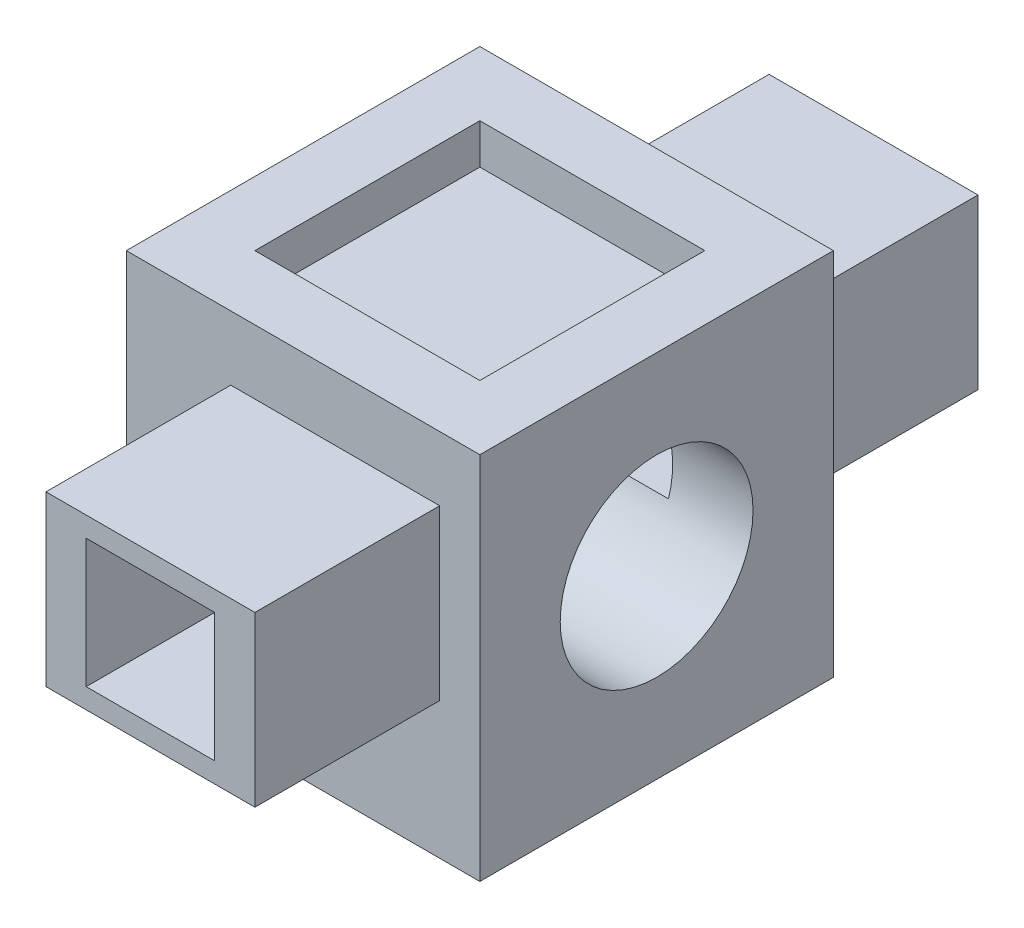
ISO-10303-21;
HEADER;
FILE_DESCRIPTION(('STEP AP214'),'2;1');
FILE_NAME('part.step','',(''),(''),'','','');
FILE_SCHEMA(('AUTOMOTIVE_DESIGN { 1 0 10303 214 1 1 1 1 }'));
ENDSEC;
DATA;
#1=APPLICATION_CONTEXT('core data for automotive mechanical design processes');
#2=APPLICATION_PROTOCOL_DEFINITION('international standard','automotive_design',2000,#1);
#3=PRODUCT_CONTEXT('',#1,'mechanical');
#4=PRODUCT('Part','Part','',(#3));
#5=PRODUCT_RELATED_PRODUCT_CATEGORY('part','',(#4));
#6=PRODUCT_DEFINITION_FORMATION('','',#4);
#7=PRODUCT_DEFINITION_CONTEXT('part definition',#1,'design');
#8=PRODUCT_DEFINITION('design','',#6,#7);
#9=PRODUCT_DEFINITION_SHAPE('','',#8);
#10=(LENGTH_UNIT() NAMED_UNIT(*) SI_UNIT(.MILLI.,.METRE.));
#11=(NAMED_UNIT(*) PLANE_ANGLE_UNIT() SI_UNIT($,.RADIAN.));
#12=(NAMED_UNIT(*) SI_UNIT($,.STERADIAN.) SOLID_ANGLE_UNIT());
#13=UNCERTAINTY_MEASURE_WITH_UNIT(LENGTH_MEASURE(1.E-05),#10,'distance_accuracy_value','');
#14=(GEOMETRIC_REPRESENTATION_CONTEXT(3) GLOBAL_UNCERTAINTY_ASSIGNED_CONTEXT((#13)) GLOBAL_UNIT_ASSIGNED_CONTEXT((#10,
#11,#12)) REPRESENTATION_CONTEXT('',''));
#15=CARTESIAN_POINT('',(0.,0.,0.));
#16=DIRECTION('',(0.,0.,1.));
#17=DIRECTION('',(1.,0.,0.));
#18=AXIS2_PLACEMENT_3D('',#15,#16,#17);
#19=CARTESIAN_POINT('',(34.,19.5,-45.));
#20=DIRECTION('',(0.,-1.,0.));
#21=DIRECTION('',(0.,0.,-1.));
#22=AXIS2_PLACEMENT_3D('',#19,#20,#21);
#23=PLANE('',#22);
#24=DIRECTION('',(0.,0.,1.));
#25=VECTOR('',#24,1.);
#26=CARTESIAN_POINT('',(18.,19.5,-45.));
#27=LINE('',#26,#25);
#28=CARTESIAN_POINT('',(18.,19.5,-45.));
#29=VERTEX_POINT('',#28);
#30=CARTESIAN_POINT('',(18.,19.5,-11.478240283249));
#31=VERTEX_POINT('',#30);
#32=EDGE_CURVE('E258',#29,#31,#27,.T.);
#33=ORIENTED_EDGE('',*,*,#32,.T.);
#34=DIRECTION('',(1.,0.,0.));
#35=VECTOR('',#34,1.);
#36=CARTESIAN_POINT('',(0.,19.5,-11.478240283249));
#37=LINE('',#36,#35);
#38=CARTESIAN_POINT('',(34.,19.5,-11.478240283249));
#39=VERTEX_POINT('',#38);
#40=EDGE_CURVE('E11',#31,#39,#37,.T.);
#41=ORIENTED_EDGE('',*,*,#40,.T.);
#42=DIRECTION('',(0.,0.,1.));
#43=VECTOR('',#42,1.);
#44=CARTESIAN_POINT('',(34.,19.5,-45.));
#45=LINE('',#44,#43);
#46=CARTESIAN_POINT('',(34.,19.5,-45.));
#47=VERTEX_POINT('',#46);
#48=EDGE_CURVE('E254',#47,#39,#45,.T.);
#49=ORIENTED_EDGE('',*,*,#48,.F.);
#50=DIRECTION('',(1.,0.,0.));
#51=VECTOR('',#50,1.);
#52=CARTESIAN_POINT('',(34.,19.5,-45.));
#53=LINE('',#52,#51);
#54=EDGE_CURVE('E237',#29,#47,#53,.T.);
#55=ORIENTED_EDGE('',*,*,#54,.F.);
#56=EDGE_LOOP('',(#33,#41,#49,#55));
#57=FACE_BOUND('',#56,.T.);
#58=ADVANCED_FACE('F37',(#57),#23,.F.);
#59=CARTESIAN_POINT('',(0.,0.,22.));
#60=DIRECTION('',(1.,0.,0.));
#61=DIRECTION('',(0.,0.,-1.));
#62=AXIS2_PLACEMENT_3D('',#59,#60,#61);
#63=PLANE('',#62);
#64=CARTESIAN_POINT('',(0.,23.,0.));
#65=DIRECTION('',(1.,0.,0.));
#66=DIRECTION('',(0.,0.,-1.));
#67=AXIS2_PLACEMENT_3D('',#64,#65,#66);
#68=CIRCLE('',#67,12.);
#69=CARTESIAN_POINT('',(0.,23.,-12.));
#70=VERTEX_POINT('',#69);
#71=EDGE_CURVE('E225',#70,#70,#68,.T.);
#72=ORIENTED_EDGE('',*,*,#71,.T.);
#73=EDGE_LOOP('',(#72));
#74=FACE_BOUND('',#73,.T.);
#75=DIRECTION('',(0.,-1.,0.));
#76=VECTOR('',#75,1.);
#77=CARTESIAN_POINT('',(0.,0.,-22.));
#78=LINE('',#77,#76);
#79=CARTESIAN_POINT('',(0.,46.,-22.));
#80=VERTEX_POINT('',#79);
#81=CARTESIAN_POINT('',(0.,0.,-22.));
#82=VERTEX_POINT('',#81);
#83=EDGE_CURVE('E312',#80,#82,#78,.T.);
#84=ORIENTED_EDGE('',*,*,#83,.T.);
#85=DIRECTION('',(0.,0.,-1.));
#86=VECTOR('',#85,1.);
#87=CARTESIAN_POINT('',(0.,0.,22.));
#88=LINE('',#87,#86);
#89=CARTESIAN_POINT('',(0.,0.,22.));
#90=VERTEX_POINT('',#89);
#91=EDGE_CURVE('E339',#90,#82,#88,.T.);
#92=ORIENTED_EDGE('',*,*,#91,.F.);
#93=DIRECTION('',(0.,-1.,0.));
#94=VECTOR('',#93,1.);
#95=CARTESIAN_POINT('',(0.,0.,22.));
#96=LINE('',#95,#94);
#97=CARTESIAN_POINT('',(0.,46.,22.));
#98=VERTEX_POINT('',#97);
#99=EDGE_CURVE('E313',#98,#90,#96,.T.);
#100=ORIENTED_EDGE('',*,*,#99,.F.);
#101=DIRECTION('',(0.,0.,-1.));
#102=VECTOR('',#101,1.);
#103=CARTESIAN_POINT('',(0.,46.,22.));
#104=LINE('',#103,#102);
#105=EDGE_CURVE('E323',#98,#80,#104,.T.);
#106=ORIENTED_EDGE('',*,*,#105,.T.);
#107=EDGE_LOOP('',(#84,#92,#100,#106));
#108=FACE_BOUND('',#107,.T.);
#109=ADVANCED_FACE('F39',(#74,#108),#63,.F.);
#110=CARTESIAN_POINT('',(0.,0.,22.));
#111=DIRECTION('',(0.,1.,0.));
#112=DIRECTION('',(0.,0.,1.));
#113=AXIS2_PLACEMENT_3D('',#110,#111,#112);
#114=PLANE('',#113);
#115=DIRECTION('',(1.,0.,0.));
#116=VECTOR('',#115,1.);
#117=CARTESIAN_POINT('',(0.,0.,-22.));
#118=LINE('',#117,#116);
#119=CARTESIAN_POINT('',(44.,0.,-22.));
#120=VERTEX_POINT('',#119);
#121=EDGE_CURVE('E326',#82,#120,#118,.T.);
#122=ORIENTED_EDGE('',*,*,#121,.T.);
#123=DIRECTION('',(0.,0.,-1.));
#124=VECTOR('',#123,1.);
#125=CARTESIAN_POINT('',(44.,0.,22.));
#126=LINE('',#125,#124);
#127=CARTESIAN_POINT('',(44.,0.,22.));
#128=VERTEX_POINT('',#127);
#129=EDGE_CURVE('E336',#128,#120,#126,.T.);
#130=ORIENTED_EDGE('',*,*,#129,.F.);
#131=DIRECTION('',(1.,0.,0.));
#132=VECTOR('',#131,1.);
#133=CARTESIAN_POINT('',(0.,0.,22.));
#134=LINE('',#133,#132);
#135=EDGE_CURVE('E316',#90,#128,#134,.T.);
#136=ORIENTED_EDGE('',*,*,#135,.F.);
#137=ORIENTED_EDGE('',*,*,#91,.T.);
#138=EDGE_LOOP('',(#122,#130,#136,#137));
#139=FACE_BOUND('',#138,.T.);
#140=ADVANCED_FACE('F406',(#139),#114,.F.);
#141=CARTESIAN_POINT('',(44.,0.,22.));
#142=DIRECTION('',(-1.,0.,0.));
#143=DIRECTION('',(0.,0.,1.));
#144=AXIS2_PLACEMENT_3D('',#141,#142,#143);
#145=PLANE('',#144);
#146=CARTESIAN_POINT('',(44.,23.,0.));
#147=DIRECTION('',(1.,0.,0.));
#148=DIRECTION('',(0.,0.,-1.));
#149=AXIS2_PLACEMENT_3D('',#146,#147,#148);
#150=CIRCLE('',#149,12.);
#151=CARTESIAN_POINT('',(44.,23.,-12.));
#152=VERTEX_POINT('',#151);
#153=EDGE_CURVE('E221',#152,#152,#150,.T.);
#154=ORIENTED_EDGE('',*,*,#153,.F.);
#155=EDGE_LOOP('',(#154));
#156=FACE_BOUND('',#155,.T.);
#157=DIRECTION('',(0.,1.,0.));
#158=VECTOR('',#157,1.);
#159=CARTESIAN_POINT('',(44.,0.,-22.));
#160=LINE('',#159,#158);
#161=CARTESIAN_POINT('',(44.,46.,-22.));
#162=VERTEX_POINT('',#161);
#163=EDGE_CURVE('E328',#120,#162,#160,.T.);
#164=ORIENTED_EDGE('',*,*,#163,.T.);
#165=DIRECTION('',(0.,0.,-1.));
#166=VECTOR('',#165,1.);
#167=CARTESIAN_POINT('',(44.,46.,22.));
#168=LINE('',#167,#166);
#169=CARTESIAN_POINT('',(44.,46.,22.));
#170=VERTEX_POINT('',#169);
#171=EDGE_CURVE('E333',#170,#162,#168,.T.);
#172=ORIENTED_EDGE('',*,*,#171,.F.);
#173=DIRECTION('',(0.,1.,0.));
#174=VECTOR('',#173,1.);
#175=CARTESIAN_POINT('',(44.,0.,22.));
#176=LINE('',#175,#174);
#177=EDGE_CURVE('E319',#128,#170,#176,.T.);
#178=ORIENTED_EDGE('',*,*,#177,.F.);
#179=ORIENTED_EDGE('',*,*,#129,.T.);
#180=EDGE_LOOP('',(#164,#172,#178,#179));
#181=FACE_BOUND('',#180,.T.);
#182=ADVANCED_FACE('F447',(#156,#181),#145,.F.);
#183=CARTESIAN_POINT('',(0.,46.,22.));
#184=DIRECTION('',(0.,-1.,0.));
#185=DIRECTION('',(0.,0.,-1.));
#186=AXIS2_PLACEMENT_3D('',#183,#184,#185);
#187=PLANE('',#186);
#188=DIRECTION('',(1.,0.,0.));
#189=VECTOR('',#188,1.);
#190=CARTESIAN_POINT('',(36.,46.,14.));
#191=LINE('',#190,#189);
#192=CARTESIAN_POINT('',(7.99999999999999,46.,14.));
#193=VERTEX_POINT('',#192);
#194=CARTESIAN_POINT('',(36.,46.,14.));
#195=VERTEX_POINT('',#194);
#196=EDGE_CURVE('E215',#193,#195,#191,.T.);
#197=ORIENTED_EDGE('',*,*,#196,.F.);
#198=DIRECTION('',(0.,0.,1.));
#199=VECTOR('',#198,1.);
#200=CARTESIAN_POINT('',(7.99999999999999,46.,14.));
#201=LINE('',#200,#199);
#202=CARTESIAN_POINT('',(7.99999999999999,46.,-14.));
#203=VERTEX_POINT('',#202);
#204=EDGE_CURVE('E52',#203,#193,#201,.T.);
#205=ORIENTED_EDGE('',*,*,#204,.F.);
#206=DIRECTION('',(-1.,0.,0.));
#207=VECTOR('',#206,1.);
#208=CARTESIAN_POINT('',(36.,46.,-14.));
#209=LINE('',#208,#207);
#210=CARTESIAN_POINT('',(36.,46.,-14.));
#211=VERTEX_POINT('',#210);
#212=EDGE_CURVE('E206',#211,#203,#209,.T.);
#213=ORIENTED_EDGE('',*,*,#212,.F.);
#214=DIRECTION('',(0.,0.,-1.));
#215=VECTOR('',#214,1.);
#216=CARTESIAN_POINT('',(36.,46.,14.));
#217=LINE('',#216,#215);
#218=EDGE_CURVE('E209',#195,#211,#217,.T.);
#219=ORIENTED_EDGE('',*,*,#218,.F.);
#220=EDGE_LOOP('',(#197,#205,#213,#219));
#221=FACE_BOUND('',#220,.T.);
#222=DIRECTION('',(-1.,0.,0.));
#223=VECTOR('',#222,1.);
#224=CARTESIAN_POINT('',(0.,46.,-22.));
#225=LINE('',#224,#223);
#226=EDGE_CURVE('E317',#162,#80,#225,.T.);
#227=ORIENTED_EDGE('',*,*,#226,.T.);
#228=ORIENTED_EDGE('',*,*,#105,.F.);
#229=DIRECTION('',(-1.,0.,0.));
#230=VECTOR('',#229,1.);
#231=CARTESIAN_POINT('',(0.,46.,22.));
#232=LINE('',#231,#230);
#233=EDGE_CURVE('E321',#170,#98,#232,.T.);
#234=ORIENTED_EDGE('',*,*,#233,.F.);
#235=ORIENTED_EDGE('',*,*,#171,.T.);
#236=EDGE_LOOP('',(#227,#228,#234,#235));
#237=FACE_BOUND('',#236,.T.);
#238=ADVANCED_FACE('F440',(#221,#237),#187,.F.);
#239=CARTESIAN_POINT('',(0.,0.,22.));
#240=DIRECTION('',(0.,0.,-1.));
#241=DIRECTION('',(-1.,0.,0.));
#242=AXIS2_PLACEMENT_3D('',#239,#240,#241);
#243=PLANE('',#242);
#244=DIRECTION('',(-1.,0.,0.));
#245=VECTOR('',#244,1.);
#246=CARTESIAN_POINT('',(0.,17.,22.));
#247=LINE('',#246,#245);
#248=CARTESIAN_POINT('',(39.,17.,22.));
#249=VERTEX_POINT('',#248);
#250=CARTESIAN_POINT('',(13.,17.,22.));
#251=VERTEX_POINT('',#250);
#252=EDGE_CURVE('E288',#249,#251,#247,.T.);
#253=ORIENTED_EDGE('',*,*,#252,.T.);
#254=DIRECTION('',(0.,1.,0.));
#255=VECTOR('',#254,1.);
#256=CARTESIAN_POINT('',(13.,0.,22.));
#257=LINE('',#256,#255);
#258=CARTESIAN_POINT('',(13.,38.,22.));
#259=VERTEX_POINT('',#258);
#260=EDGE_CURVE('E309',#251,#259,#257,.T.);
#261=ORIENTED_EDGE('',*,*,#260,.T.);
#262=DIRECTION('',(1.,0.,0.));
#263=VECTOR('',#262,1.);
#264=CARTESIAN_POINT('',(0.,38.,22.));
#265=LINE('',#264,#263);
#266=CARTESIAN_POINT('',(39.,38.,22.));
#267=VERTEX_POINT('',#266);
#268=EDGE_CURVE('E306',#259,#267,#265,.T.);
#269=ORIENTED_EDGE('',*,*,#268,.T.);
#270=DIRECTION('',(0.,-1.,0.));
#271=VECTOR('',#270,1.);
#272=CARTESIAN_POINT('',(39.,0.,22.));
#273=LINE('',#272,#271);
#274=EDGE_CURVE('E303',#267,#249,#273,.T.);
#275=ORIENTED_EDGE('',*,*,#274,.T.);
#276=EDGE_LOOP('',(#253,#261,#269,#275));
#277=FACE_BOUND('',#276,.T.);
#278=ORIENTED_EDGE('',*,*,#99,.T.);
#279=ORIENTED_EDGE('',*,*,#135,.T.);
#280=ORIENTED_EDGE('',*,*,#177,.T.);
#281=ORIENTED_EDGE('',*,*,#233,.T.);
#282=EDGE_LOOP('',(#278,#279,#280,#281));
#283=FACE_BOUND('',#282,.T.);
#284=ADVANCED_FACE('F437',(#277,#283),#243,.F.);
#285=CARTESIAN_POINT('',(0.,0.,-22.));
#286=DIRECTION('',(0.,0.,-1.));
#287=DIRECTION('',(-1.,0.,0.));
#288=AXIS2_PLACEMENT_3D('',#285,#286,#287);
#289=PLANE('',#288);
#290=DIRECTION('',(0.,1.,0.));
#291=VECTOR('',#290,1.);
#292=CARTESIAN_POINT('',(13.,0.,-22.));
#293=LINE('',#292,#291);
#294=CARTESIAN_POINT('',(13.,17.,-22.));
#295=VERTEX_POINT('',#294);
#296=CARTESIAN_POINT('',(13.,38.,-22.));
#297=VERTEX_POINT('',#296);
#298=EDGE_CURVE('E351',#295,#297,#293,.T.);
#299=ORIENTED_EDGE('',*,*,#298,.F.);
#300=DIRECTION('',(-1.,0.,0.));
#301=VECTOR('',#300,1.);
#302=CARTESIAN_POINT('',(0.,17.,-22.));
#303=LINE('',#302,#301);
#304=CARTESIAN_POINT('',(39.,17.,-22.));
#305=VERTEX_POINT('',#304);
#306=EDGE_CURVE('E342',#305,#295,#303,.T.);
#307=ORIENTED_EDGE('',*,*,#306,.F.);
#308=DIRECTION('',(0.,-1.,0.));
#309=VECTOR('',#308,1.);
#310=CARTESIAN_POINT('',(39.,0.,-22.));
#311=LINE('',#310,#309);
#312=CARTESIAN_POINT('',(39.,38.,-22.));
#313=VERTEX_POINT('',#312);
#314=EDGE_CURVE('E345',#313,#305,#311,.T.);
#315=ORIENTED_EDGE('',*,*,#314,.F.);
#316=DIRECTION('',(1.,0.,0.));
#317=VECTOR('',#316,1.);
#318=CARTESIAN_POINT('',(0.,38.,-22.));
#319=LINE('',#318,#317);
#320=EDGE_CURVE('E348',#297,#313,#319,.T.);
#321=ORIENTED_EDGE('',*,*,#320,.F.);
#322=EDGE_LOOP('',(#299,#307,#315,#321));
#323=FACE_BOUND('',#322,.T.);
#324=ORIENTED_EDGE('',*,*,#83,.F.);
#325=ORIENTED_EDGE('',*,*,#226,.F.);
#326=ORIENTED_EDGE('',*,*,#163,.F.);
#327=ORIENTED_EDGE('',*,*,#121,.F.);
#328=EDGE_LOOP('',(#324,#325,#326,#327));
#329=FACE_BOUND('',#328,.T.);
#330=ADVANCED_FACE('F418',(#323,#329),#289,.T.);
#331=CARTESIAN_POINT('',(0.,0.,-45.));
#332=DIRECTION('',(0.,0.,-1.));
#333=DIRECTION('',(-1.,0.,0.));
#334=AXIS2_PLACEMENT_3D('',#331,#332,#333);
#335=PLANE('',#334);
#336=DIRECTION('',(0.,-1.,0.));
#337=VECTOR('',#336,1.);
#338=CARTESIAN_POINT('',(18.,35.5,-45.));
#339=LINE('',#338,#337);
#340=CARTESIAN_POINT('',(18.,35.5,-45.));
#341=VERTEX_POINT('',#340);
#342=EDGE_CURVE('E234',#341,#29,#339,.T.);
#343=ORIENTED_EDGE('',*,*,#342,.T.);
#344=ORIENTED_EDGE('',*,*,#54,.T.);
#345=DIRECTION('',(0.,1.,0.));
#346=VECTOR('',#345,1.);
#347=CARTESIAN_POINT('',(34.,35.5,-45.));
#348=LINE('',#347,#346);
#349=CARTESIAN_POINT('',(34.,35.5,-45.));
#350=VERTEX_POINT('',#349);
#351=EDGE_CURVE('E240',#47,#350,#348,.T.);
#352=ORIENTED_EDGE('',*,*,#351,.T.);
#353=DIRECTION('',(-1.,0.,0.));
#354=VECTOR('',#353,1.);
#355=CARTESIAN_POINT('',(18.,35.5,-45.));
#356=LINE('',#355,#354);
#357=EDGE_CURVE('E243',#350,#341,#356,.T.);
#358=ORIENTED_EDGE('',*,*,#357,.T.);
#359=EDGE_LOOP('',(#343,#344,#352,#358));
#360=FACE_BOUND('',#359,.T.);
#361=DIRECTION('',(0.,-1.,0.));
#362=VECTOR('',#361,1.);
#363=CARTESIAN_POINT('',(13.,17.,-45.));
#364=LINE('',#363,#362);
#365=CARTESIAN_POINT('',(13.,38.,-45.));
#366=VERTEX_POINT('',#365);
#367=CARTESIAN_POINT('',(13.,17.,-45.));
#368=VERTEX_POINT('',#367);
#369=EDGE_CURVE('E272',#366,#368,#364,.T.);
#370=ORIENTED_EDGE('',*,*,#369,.F.);
#371=DIRECTION('',(-1.,0.,0.));
#372=VECTOR('',#371,1.);
#373=CARTESIAN_POINT('',(13.,38.,-45.));
#374=LINE('',#373,#372);
#375=CARTESIAN_POINT('',(39.,38.,-45.));
#376=VERTEX_POINT('',#375);
#377=EDGE_CURVE('E281',#376,#366,#374,.T.);
#378=ORIENTED_EDGE('',*,*,#377,.F.);
#379=DIRECTION('',(0.,1.,0.));
#380=VECTOR('',#379,1.);
#381=CARTESIAN_POINT('',(39.,17.,-45.));
#382=LINE('',#381,#380);
#383=CARTESIAN_POINT('',(39.,17.,-45.));
#384=VERTEX_POINT('',#383);
#385=EDGE_CURVE('E278',#384,#376,#382,.T.);
#386=ORIENTED_EDGE('',*,*,#385,.F.);
#387=DIRECTION('',(1.,0.,0.));
#388=VECTOR('',#387,1.);
#389=CARTESIAN_POINT('',(13.,17.,-45.));
#390=LINE('',#389,#388);
#391=EDGE_CURVE('E275',#368,#384,#390,.T.);
#392=ORIENTED_EDGE('',*,*,#391,.F.);
#393=EDGE_LOOP('',(#370,#378,#386,#392));
#394=FACE_BOUND('',#393,.T.);
#395=ADVANCED_FACE('F383',(#360,#394),#335,.T.);
#396=CARTESIAN_POINT('',(13.,17.,-45.));
#397=DIRECTION('',(0.,-1.,0.));
#398=DIRECTION('',(0.,0.,-1.));
#399=AXIS2_PLACEMENT_3D('',#396,#397,#398);
#400=PLANE('',#399);
#401=DIRECTION('',(0.,0.,1.));
#402=VECTOR('',#401,1.);
#403=CARTESIAN_POINT('',(39.,17.,-45.));
#404=LINE('',#403,#402);
#405=EDGE_CURVE('E294',#384,#305,#404,.T.);
#406=ORIENTED_EDGE('',*,*,#405,.T.);
#407=ORIENTED_EDGE('',*,*,#306,.T.);
#408=DIRECTION('',(0.,0.,1.));
#409=VECTOR('',#408,1.);
#410=CARTESIAN_POINT('',(13.,17.,-45.));
#411=LINE('',#410,#409);
#412=EDGE_CURVE('E298',#368,#295,#411,.T.);
#413=ORIENTED_EDGE('',*,*,#412,.F.);
#414=ORIENTED_EDGE('',*,*,#391,.T.);
#415=EDGE_LOOP('',(#406,#407,#413,#414));
#416=FACE_BOUND('',#415,.T.);
#417=ADVANCED_FACE('F417',(#416),#400,.T.);
#418=CARTESIAN_POINT('',(39.,17.,-45.));
#419=DIRECTION('',(1.,0.,0.));
#420=DIRECTION('',(0.,0.,-1.));
#421=AXIS2_PLACEMENT_3D('',#418,#419,#420);
#422=PLANE('',#421);
#423=DIRECTION('',(0.,0.,1.));
#424=VECTOR('',#423,1.);
#425=CARTESIAN_POINT('',(39.,38.,-45.));
#426=LINE('',#425,#424);
#427=EDGE_CURVE('E290',#376,#313,#426,.T.);
#428=ORIENTED_EDGE('',*,*,#427,.T.);
#429=ORIENTED_EDGE('',*,*,#314,.T.);
#430=ORIENTED_EDGE('',*,*,#405,.F.);
#431=ORIENTED_EDGE('',*,*,#385,.T.);
#432=EDGE_LOOP('',(#428,#429,#430,#431));
#433=FACE_BOUND('',#432,.T.);
#434=ADVANCED_FACE('F423',(#433),#422,.T.);
#435=CARTESIAN_POINT('',(13.,38.,-45.));
#436=DIRECTION('',(0.,1.,0.));
#437=DIRECTION('',(0.,0.,1.));
#438=AXIS2_PLACEMENT_3D('',#435,#436,#437);
#439=PLANE('',#438);
#440=DIRECTION('',(0.,0.,1.));
#441=VECTOR('',#440,1.);
#442=CARTESIAN_POINT('',(13.,38.,-45.));
#443=LINE('',#442,#441);
#444=EDGE_CURVE('E285',#366,#297,#443,.T.);
#445=ORIENTED_EDGE('',*,*,#444,.T.);
#446=ORIENTED_EDGE('',*,*,#320,.T.);
#447=ORIENTED_EDGE('',*,*,#427,.F.);
#448=ORIENTED_EDGE('',*,*,#377,.T.);
#449=EDGE_LOOP('',(#445,#446,#447,#448));
#450=FACE_BOUND('',#449,.T.);
#451=ADVANCED_FACE('F419',(#450),#439,.T.);
#452=CARTESIAN_POINT('',(13.,17.,-45.));
#453=DIRECTION('',(-1.,0.,0.));
#454=DIRECTION('',(0.,0.,1.));
#455=AXIS2_PLACEMENT_3D('',#452,#453,#454);
#456=PLANE('',#455);
#457=ORIENTED_EDGE('',*,*,#412,.T.);
#458=ORIENTED_EDGE('',*,*,#298,.T.);
#459=ORIENTED_EDGE('',*,*,#444,.F.);
#460=ORIENTED_EDGE('',*,*,#369,.T.);
#461=EDGE_LOOP('',(#457,#458,#459,#460));
#462=FACE_BOUND('',#461,.T.);
#463=ADVANCED_FACE('F422',(#462),#456,.T.);
#464=ORIENTED_EDGE('',*,*,#260,.F.);
#465=CARTESIAN_POINT('',(13.,17.,45.));
#466=VERTEX_POINT('',#465);
#467=EDGE_CURVE('E284',#251,#466,#411,.T.);
#468=ORIENTED_EDGE('',*,*,#467,.T.);
#469=DIRECTION('',(0.,-1.,0.));
#470=VECTOR('',#469,1.);
#471=CARTESIAN_POINT('',(13.,17.,45.));
#472=LINE('',#471,#470);
#473=CARTESIAN_POINT('',(13.,38.,45.));
#474=VERTEX_POINT('',#473);
#475=EDGE_CURVE('E250',#474,#466,#472,.T.);
#476=ORIENTED_EDGE('',*,*,#475,.F.);
#477=EDGE_CURVE('E289',#259,#474,#443,.T.);
#478=ORIENTED_EDGE('',*,*,#477,.F.);
#479=EDGE_LOOP('',(#464,#468,#476,#478));
#480=FACE_BOUND('',#479,.T.);
#481=ADVANCED_FACE('F435',(#480),#456,.T.);
#482=ORIENTED_EDGE('',*,*,#268,.F.);
#483=ORIENTED_EDGE('',*,*,#477,.T.);
#484=DIRECTION('',(-1.,0.,0.));
#485=VECTOR('',#484,1.);
#486=CARTESIAN_POINT('',(13.,38.,45.));
#487=LINE('',#486,#485);
#488=CARTESIAN_POINT('',(39.,38.,45.));
#489=VERTEX_POINT('',#488);
#490=EDGE_CURVE('E269',#489,#474,#487,.T.);
#491=ORIENTED_EDGE('',*,*,#490,.F.);
#492=EDGE_CURVE('E293',#267,#489,#426,.T.);
#493=ORIENTED_EDGE('',*,*,#492,.F.);
#494=EDGE_LOOP('',(#482,#483,#491,#493));
#495=FACE_BOUND('',#494,.T.);
#496=ADVANCED_FACE('F425',(#495),#439,.T.);
#497=ORIENTED_EDGE('',*,*,#274,.F.);
#498=ORIENTED_EDGE('',*,*,#492,.T.);
#499=DIRECTION('',(0.,1.,0.));
#500=VECTOR('',#499,1.);
#501=CARTESIAN_POINT('',(39.,17.,45.));
#502=LINE('',#501,#500);
#503=CARTESIAN_POINT('',(39.,17.,45.));
#504=VERTEX_POINT('',#503);
#505=EDGE_CURVE('E266',#504,#489,#502,.T.);
#506=ORIENTED_EDGE('',*,*,#505,.F.);
#507=EDGE_CURVE('E297',#249,#504,#404,.T.);
#508=ORIENTED_EDGE('',*,*,#507,.F.);
#509=EDGE_LOOP('',(#497,#498,#506,#508));
#510=FACE_BOUND('',#509,.T.);
#511=ADVANCED_FACE('F429',(#510),#422,.T.);
#512=ORIENTED_EDGE('',*,*,#252,.F.);
#513=ORIENTED_EDGE('',*,*,#507,.T.);
#514=DIRECTION('',(1.,0.,0.));
#515=VECTOR('',#514,1.);
#516=CARTESIAN_POINT('',(13.,17.,45.));
#517=LINE('',#516,#515);
#518=EDGE_CURVE('E263',#466,#504,#517,.T.);
#519=ORIENTED_EDGE('',*,*,#518,.F.);
#520=ORIENTED_EDGE('',*,*,#467,.F.);
#521=EDGE_LOOP('',(#512,#513,#519,#520));
#522=FACE_BOUND('',#521,.T.);
#523=ADVANCED_FACE('F414',(#522),#400,.T.);
#524=CARTESIAN_POINT('',(0.,0.,45.));
#525=DIRECTION('',(0.,0.,-1.));
#526=DIRECTION('',(-1.,0.,0.));
#527=AXIS2_PLACEMENT_3D('',#524,#525,#526);
#528=PLANE('',#527);
#529=DIRECTION('',(-1.,0.,0.));
#530=VECTOR('',#529,1.);
#531=CARTESIAN_POINT('',(0.,19.5,45.));
#532=LINE('',#531,#530);
#533=CARTESIAN_POINT('',(34.,19.5,45.));
#534=VERTEX_POINT('',#533);
#535=CARTESIAN_POINT('',(18.,19.5,45.));
#536=VERTEX_POINT('',#535);
#537=EDGE_CURVE('E354',#534,#536,#532,.T.);
#538=ORIENTED_EDGE('',*,*,#537,.T.);
#539=DIRECTION('',(0.,1.,0.));
#540=VECTOR('',#539,1.);
#541=CARTESIAN_POINT('',(18.,0.,45.));
#542=LINE('',#541,#540);
#543=CARTESIAN_POINT('',(18.,35.5,45.));
#544=VERTEX_POINT('',#543);
#545=EDGE_CURVE('E363',#536,#544,#542,.T.);
#546=ORIENTED_EDGE('',*,*,#545,.T.);
#547=DIRECTION('',(1.,0.,0.));
#548=VECTOR('',#547,1.);
#549=CARTESIAN_POINT('',(0.,35.5,45.));
#550=LINE('',#549,#548);
#551=CARTESIAN_POINT('',(34.,35.5,45.));
#552=VERTEX_POINT('',#551);
#553=EDGE_CURVE('E360',#544,#552,#550,.T.);
#554=ORIENTED_EDGE('',*,*,#553,.T.);
#555=DIRECTION('',(0.,-1.,0.));
#556=VECTOR('',#555,1.);
#557=CARTESIAN_POINT('',(34.,0.,45.));
#558=LINE('',#557,#556);
#559=EDGE_CURVE('E357',#552,#534,#558,.T.);
#560=ORIENTED_EDGE('',*,*,#559,.T.);
#561=EDGE_LOOP('',(#538,#546,#554,#560));
#562=FACE_BOUND('',#561,.T.);
#563=ORIENTED_EDGE('',*,*,#475,.T.);
#564=ORIENTED_EDGE('',*,*,#518,.T.);
#565=ORIENTED_EDGE('',*,*,#505,.T.);
#566=ORIENTED_EDGE('',*,*,#490,.T.);
#567=EDGE_LOOP('',(#563,#564,#565,#566));
#568=FACE_BOUND('',#567,.T.);
#569=ADVANCED_FACE('F375',(#562,#568),#528,.F.);
#570=CARTESIAN_POINT('',(18.,35.5,-45.));
#571=DIRECTION('',(-1.,0.,0.));
#572=DIRECTION('',(0.,0.,1.));
#573=AXIS2_PLACEMENT_3D('',#570,#571,#572);
#574=PLANE('',#573);
#575=CARTESIAN_POINT('',(18.,19.5,11.478240283249));
#576=VERTEX_POINT('',#575);
#577=EDGE_CURVE('E246',#576,#536,#27,.T.);
#578=ORIENTED_EDGE('',*,*,#577,.F.);
#579=CARTESIAN_POINT('',(18.,23.,0.));
#580=DIRECTION('',(-1.,0.,0.));
#581=DIRECTION('',(0.,0.,1.));
#582=AXIS2_PLACEMENT_3D('',#579,#580,#581);
#583=CIRCLE('',#582,12.);
#584=EDGE_CURVE('E60',#576,#31,#583,.T.);
#585=ORIENTED_EDGE('',*,*,#584,.T.);
#586=ORIENTED_EDGE('',*,*,#32,.F.);
#587=ORIENTED_EDGE('',*,*,#342,.F.);
#588=DIRECTION('',(0.,0.,1.));
#589=VECTOR('',#588,1.);
#590=CARTESIAN_POINT('',(18.,35.5,-45.));
#591=LINE('',#590,#589);
#592=EDGE_CURVE('E247',#341,#544,#591,.T.);
#593=ORIENTED_EDGE('',*,*,#592,.T.);
#594=ORIENTED_EDGE('',*,*,#545,.F.);
#595=EDGE_LOOP('',(#578,#585,#586,#587,#593,#594));
#596=FACE_BOUND('',#595,.T.);
#597=ADVANCED_FACE('F372',(#596),#574,.F.);
#598=CARTESIAN_POINT('',(18.,35.5,-45.));
#599=DIRECTION('',(0.,1.,0.));
#600=DIRECTION('',(-1.,0.,0.));
#601=AXIS2_PLACEMENT_3D('',#598,#599,#600);
#602=PLANE('',#601);
#603=ORIENTED_EDGE('',*,*,#592,.F.);
#604=ORIENTED_EDGE('',*,*,#357,.F.);
#605=DIRECTION('',(0.,0.,1.));
#606=VECTOR('',#605,1.);
#607=CARTESIAN_POINT('',(34.,35.5,-45.));
#608=LINE('',#607,#606);
#609=EDGE_CURVE('E251',#350,#552,#608,.T.);
#610=ORIENTED_EDGE('',*,*,#609,.T.);
#611=ORIENTED_EDGE('',*,*,#553,.F.);
#612=EDGE_LOOP('',(#603,#604,#610,#611));
#613=FACE_BOUND('',#612,.T.);
#614=ADVANCED_FACE('F381',(#613),#602,.F.);
#615=CARTESIAN_POINT('',(34.,35.5,-45.));
#616=DIRECTION('',(1.,0.,0.));
#617=DIRECTION('',(0.,0.,-1.));
#618=AXIS2_PLACEMENT_3D('',#615,#616,#617);
#619=PLANE('',#618);
#620=ORIENTED_EDGE('',*,*,#48,.T.);
#621=CARTESIAN_POINT('',(34.,23.,0.));
#622=DIRECTION('',(1.,0.,0.));
#623=DIRECTION('',(0.,0.,-1.));
#624=AXIS2_PLACEMENT_3D('',#621,#622,#623);
#625=CIRCLE('',#624,12.);
#626=CARTESIAN_POINT('',(34.,19.5,11.478240283249));
#627=VERTEX_POINT('',#626);
#628=EDGE_CURVE('E228',#39,#627,#625,.T.);
#629=ORIENTED_EDGE('',*,*,#628,.T.);
#630=EDGE_CURVE('E257',#627,#534,#45,.T.);
#631=ORIENTED_EDGE('',*,*,#630,.T.);
#632=ORIENTED_EDGE('',*,*,#559,.F.);
#633=ORIENTED_EDGE('',*,*,#609,.F.);
#634=ORIENTED_EDGE('',*,*,#351,.F.);
#635=EDGE_LOOP('',(#620,#629,#631,#632,#633,#634));
#636=FACE_BOUND('',#635,.T.);
#637=ADVANCED_FACE('F378',(#636),#619,.F.);
#638=ORIENTED_EDGE('',*,*,#630,.F.);
#639=DIRECTION('',(1.,0.,0.));
#640=VECTOR('',#639,1.);
#641=CARTESIAN_POINT('',(0.,19.5,11.478240283249));
#642=LINE('',#641,#640);
#643=EDGE_CURVE('E45',#627,#576,#642,.F.);
#644=ORIENTED_EDGE('',*,*,#643,.T.);
#645=ORIENTED_EDGE('',*,*,#577,.T.);
#646=ORIENTED_EDGE('',*,*,#537,.F.);
#647=EDGE_LOOP('',(#638,#644,#645,#646));
#648=FACE_BOUND('',#647,.T.);
#649=ADVANCED_FACE('F368',(#648),#23,.F.);
#650=CARTESIAN_POINT('',(0.,23.,0.));
#651=DIRECTION('',(1.,0.,0.));
#652=DIRECTION('',(0.,0.,-1.));
#653=AXIS2_PLACEMENT_3D('',#650,#651,#652);
#654=CYLINDRICAL_SURFACE('',#653,12.);
#655=ORIENTED_EDGE('',*,*,#71,.F.);
#656=EDGE_LOOP('',(#655));
#657=FACE_BOUND('',#656,.T.);
#658=ORIENTED_EDGE('',*,*,#153,.T.);
#659=EDGE_LOOP('',(#658));
#660=FACE_BOUND('',#659,.T.);
#661=ORIENTED_EDGE('',*,*,#584,.F.);
#662=ORIENTED_EDGE('',*,*,#643,.F.);
#663=ORIENTED_EDGE('',*,*,#628,.F.);
#664=ORIENTED_EDGE('',*,*,#40,.F.);
#665=EDGE_LOOP('',(#661,#662,#663,#664));
#666=FACE_BOUND('',#665,.T.);
#667=ADVANCED_FACE('F388',(#657,#660,#666),#654,.F.);
#668=CARTESIAN_POINT('',(7.99999999999999,41.,14.));
#669=DIRECTION('',(-1.,0.,0.));
#670=DIRECTION('',(0.,0.,1.));
#671=AXIS2_PLACEMENT_3D('',#668,#669,#670);
#672=PLANE('',#671);
#673=ORIENTED_EDGE('',*,*,#204,.T.);
#674=DIRECTION('',(0.,1.,0.));
#675=VECTOR('',#674,1.);
#676=CARTESIAN_POINT('',(7.99999999999999,41.,14.));
#677=LINE('',#676,#675);
#678=CARTESIAN_POINT('',(7.99999999999999,41.,14.));
#679=VERTEX_POINT('',#678);
#680=EDGE_CURVE('E184',#679,#193,#677,.T.);
#681=ORIENTED_EDGE('',*,*,#680,.F.);
#682=DIRECTION('',(0.,0.,1.));
#683=VECTOR('',#682,1.);
#684=CARTESIAN_POINT('',(7.99999999999999,41.,14.));
#685=LINE('',#684,#683);
#686=CARTESIAN_POINT('',(7.99999999999999,41.,-14.));
#687=VERTEX_POINT('',#686);
#688=EDGE_CURVE('E188',#687,#679,#685,.T.);
#689=ORIENTED_EDGE('',*,*,#688,.F.);
#690=DIRECTION('',(0.,1.,0.));
#691=VECTOR('',#690,1.);
#692=CARTESIAN_POINT('',(7.99999999999999,41.,-14.));
#693=LINE('',#692,#691);
#694=EDGE_CURVE('E219',#687,#203,#693,.T.);
#695=ORIENTED_EDGE('',*,*,#694,.T.);
#696=EDGE_LOOP('',(#673,#681,#689,#695));
#697=FACE_BOUND('',#696,.T.);
#698=ADVANCED_FACE('F186',(#697),#672,.F.);
#699=CARTESIAN_POINT('',(36.,41.,-14.));
#700=DIRECTION('',(0.,0.,-1.));
#701=DIRECTION('',(-1.,0.,0.));
#702=AXIS2_PLACEMENT_3D('',#699,#700,#701);
#703=PLANE('',#702);
#704=ORIENTED_EDGE('',*,*,#212,.T.);
#705=ORIENTED_EDGE('',*,*,#694,.F.);
#706=DIRECTION('',(-1.,0.,0.));
#707=VECTOR('',#706,1.);
#708=CARTESIAN_POINT('',(36.,41.,-14.));
#709=LINE('',#708,#707);
#710=CARTESIAN_POINT('',(36.,41.,-14.));
#711=VERTEX_POINT('',#710);
#712=EDGE_CURVE('E194',#711,#687,#709,.T.);
#713=ORIENTED_EDGE('',*,*,#712,.F.);
#714=DIRECTION('',(0.,1.,0.));
#715=VECTOR('',#714,1.);
#716=CARTESIAN_POINT('',(36.,41.,-14.));
#717=LINE('',#716,#715);
#718=EDGE_CURVE('E222',#711,#211,#717,.T.);
#719=ORIENTED_EDGE('',*,*,#718,.T.);
#720=EDGE_LOOP('',(#704,#705,#713,#719));
#721=FACE_BOUND('',#720,.T.);
#722=ADVANCED_FACE('F396',(#721),#703,.F.);
#723=CARTESIAN_POINT('',(36.,41.,14.));
#724=DIRECTION('',(1.,0.,0.));
#725=DIRECTION('',(0.,0.,-1.));
#726=AXIS2_PLACEMENT_3D('',#723,#724,#725);
#727=PLANE('',#726);
#728=ORIENTED_EDGE('',*,*,#218,.T.);
#729=ORIENTED_EDGE('',*,*,#718,.F.);
#730=DIRECTION('',(0.,0.,-1.));
#731=VECTOR('',#730,1.);
#732=CARTESIAN_POINT('',(36.,41.,14.));
#733=LINE('',#732,#731);
#734=CARTESIAN_POINT('',(36.,41.,14.));
#735=VERTEX_POINT('',#734);
#736=EDGE_CURVE('E202',#735,#711,#733,.T.);
#737=ORIENTED_EDGE('',*,*,#736,.F.);
#738=DIRECTION('',(0.,1.,0.));
#739=VECTOR('',#738,1.);
#740=CARTESIAN_POINT('',(36.,41.,14.));
#741=LINE('',#740,#739);
#742=EDGE_CURVE('E193',#735,#195,#741,.T.);
#743=ORIENTED_EDGE('',*,*,#742,.T.);
#744=EDGE_LOOP('',(#728,#729,#737,#743));
#745=FACE_BOUND('',#744,.T.);
#746=ADVANCED_FACE('F583',(#745),#727,.F.);
#747=CARTESIAN_POINT('',(36.,41.,14.));
#748=DIRECTION('',(0.,0.,1.));
#749=DIRECTION('',(1.,0.,0.));
#750=AXIS2_PLACEMENT_3D('',#747,#748,#749);
#751=PLANE('',#750);
#752=ORIENTED_EDGE('',*,*,#196,.T.);
#753=ORIENTED_EDGE('',*,*,#742,.F.);
#754=DIRECTION('',(1.,0.,0.));
#755=VECTOR('',#754,1.);
#756=CARTESIAN_POINT('',(36.,41.,14.));
#757=LINE('',#756,#755);
#758=EDGE_CURVE('E197',#679,#735,#757,.T.);
#759=ORIENTED_EDGE('',*,*,#758,.F.);
#760=ORIENTED_EDGE('',*,*,#680,.T.);
#761=EDGE_LOOP('',(#752,#753,#759,#760));
#762=FACE_BOUND('',#761,.T.);
#763=ADVANCED_FACE('F198',(#762),#751,.F.);
#764=CARTESIAN_POINT('',(0.,41.,0.));
#765=DIRECTION('',(0.,1.,0.));
#766=DIRECTION('',(0.,0.,1.));
#767=AXIS2_PLACEMENT_3D('',#764,#765,#766);
#768=PLANE('',#767);
#769=ORIENTED_EDGE('',*,*,#688,.T.);
#770=ORIENTED_EDGE('',*,*,#758,.T.);
#771=ORIENTED_EDGE('',*,*,#736,.T.);
#772=ORIENTED_EDGE('',*,*,#712,.T.);
#773=EDGE_LOOP('',(#769,#770,#771,#772));
#774=FACE_BOUND('',#773,.T.);
#775=ADVANCED_FACE('F204',(#774),#768,.T.);
#776=CLOSED_SHELL('',(#58,#109,#140,#182,#238,#284,#330,#395,#417,#434,#451,#463,#481,#496,#511,
#523,#569,#597,#614,#637,#649,#667,#698,#722,#746,#763,#775));
#777=MANIFOLD_SOLID_BREP('B2',#776);
#778=ADVANCED_BREP_SHAPE_REPRESENTATION('',(#18,#777),#14);
#779=SHAPE_DEFINITION_REPRESENTATION(#9,#778);
ENDSEC;
END-ISO-10303-21;
